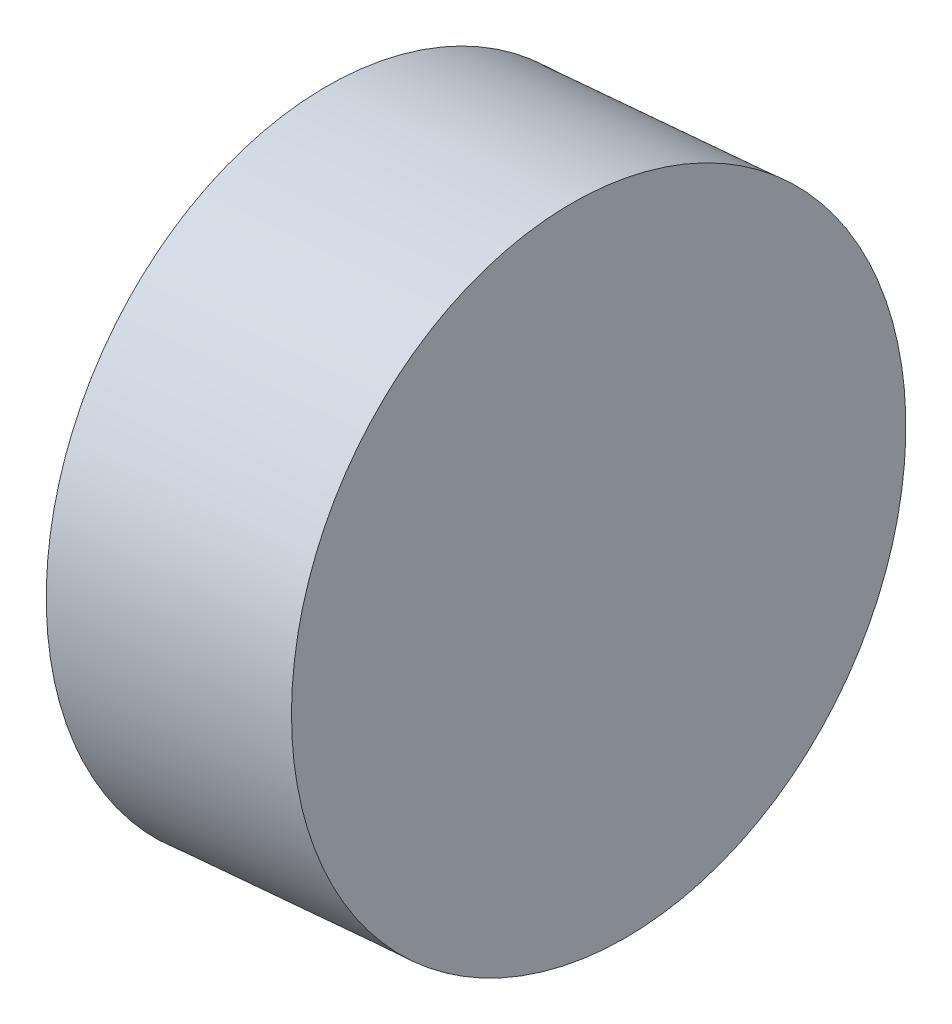
ISO-10303-21;
HEADER;
FILE_DESCRIPTION(('STEP AP214'),'2;1');
FILE_NAME('part.step','',(''),(''),'','','');
FILE_SCHEMA(('AUTOMOTIVE_DESIGN { 1 0 10303 214 1 1 1 1 }'));
ENDSEC;
DATA;
#1=APPLICATION_CONTEXT('core data for automotive mechanical design processes');
#2=APPLICATION_PROTOCOL_DEFINITION('international standard','automotive_design',2000,#1);
#3=PRODUCT_CONTEXT('',#1,'mechanical');
#4=PRODUCT('Part','Part','',(#3));
#5=PRODUCT_RELATED_PRODUCT_CATEGORY('part','',(#4));
#6=PRODUCT_DEFINITION_FORMATION('','',#4);
#7=PRODUCT_DEFINITION_CONTEXT('part definition',#1,'design');
#8=PRODUCT_DEFINITION('design','',#6,#7);
#9=PRODUCT_DEFINITION_SHAPE('','',#8);
#10=(LENGTH_UNIT() NAMED_UNIT(*) SI_UNIT(.MILLI.,.METRE.));
#11=(NAMED_UNIT(*) PLANE_ANGLE_UNIT() SI_UNIT($,.RADIAN.));
#12=(NAMED_UNIT(*) SI_UNIT($,.STERADIAN.) SOLID_ANGLE_UNIT());
#13=UNCERTAINTY_MEASURE_WITH_UNIT(LENGTH_MEASURE(1.E-05),#10,'distance_accuracy_value','');
#14=(GEOMETRIC_REPRESENTATION_CONTEXT(3) GLOBAL_UNCERTAINTY_ASSIGNED_CONTEXT((#13)) GLOBAL_UNIT_ASSIGNED_CONTEXT((#10,
#11,#12)) REPRESENTATION_CONTEXT('',''));
#15=CARTESIAN_POINT('',(0.,0.,0.));
#16=DIRECTION('',(0.,0.,1.));
#17=DIRECTION('',(1.,0.,0.));
#18=AXIS2_PLACEMENT_3D('',#15,#16,#17);
#19=CARTESIAN_POINT('',(-159.89779010804,1253.96431950315,1213.81116618222));
#20=CARTESIAN_POINT('',(-159.89779010804,1253.96431950315,1214.43169015902));
#21=CARTESIAN_POINT('',(-159.908443377123,1254.08608692596,1215.67273811262));
#22=CARTESIAN_POINT('',(-159.95576898926,1254.62702114795,1217.46277087773));
#23=CARTESIAN_POINT('',(-160.032621613177,1255.50545065893,1219.11247452223));
#24=CARTESIAN_POINT('',(-160.136047845636,1256.68761790542,1220.55845186023));
#25=CARTESIAN_POINT('',(-160.262073074526,1258.12809286309,1221.74513479354));
#26=CARTESIAN_POINT('',(-160.405854220976,1259.77151888717,1222.62691976255));
#27=CARTESIAN_POINT('',(-160.561865856161,1261.55474003717,1223.16992026539));
#28=CARTESIAN_POINT('',(-160.724112540434,1263.40922812436,1223.35326909726));
#29=CARTESIAN_POINT('',(-160.886359224707,1265.26371621155,1223.16992026539));
#30=CARTESIAN_POINT('',(-161.042370859892,1267.04693736156,1222.62691976255));
#31=CARTESIAN_POINT('',(-161.186152006342,1268.69036338563,1221.74513479354));
#32=CARTESIAN_POINT('',(-161.312177235232,1270.13083834331,1220.55845186023));
#33=CARTESIAN_POINT('',(-161.415603467691,1271.31300558979,1219.11247452223));
#34=CARTESIAN_POINT('',(-161.492456091608,1272.19143510077,1217.46277087773));
#35=CARTESIAN_POINT('',(-161.539781703746,1272.73236932276,1215.67273811262));
#36=CARTESIAN_POINT('',(-161.55576160737,1272.91502045698,1213.81116618222));
#37=CARTESIAN_POINT('',(-161.539781703746,1272.73236932276,1211.94959425181));
#38=CARTESIAN_POINT('',(-161.492456091608,1272.19143510077,1210.1595614867));
#39=CARTESIAN_POINT('',(-161.415603467691,1271.31300558979,1208.50985784221));
#40=CARTESIAN_POINT('',(-161.312177235232,1270.13083834331,1207.06388050421));
#41=CARTESIAN_POINT('',(-161.186152006342,1268.69036338563,1205.87719757089));
#42=CARTESIAN_POINT('',(-161.042370859892,1267.04693736156,1204.99541260189));
#43=CARTESIAN_POINT('',(-160.886359224707,1265.26371621155,1204.45241209904));
#44=CARTESIAN_POINT('',(-160.724112540434,1263.40922812436,1204.26906326717));
#45=CARTESIAN_POINT('',(-160.561865856161,1261.55474003717,1204.45241209904));
#46=CARTESIAN_POINT('',(-160.405854220976,1259.77151888717,1204.99541260189));
#47=CARTESIAN_POINT('',(-160.262073074526,1258.12809286309,1205.87719757089));
#48=CARTESIAN_POINT('',(-160.136047845636,1256.68761790542,1207.06388050421));
#49=CARTESIAN_POINT('',(-160.032621613177,1255.50545065893,1208.50985784221));
#50=CARTESIAN_POINT('',(-159.95576898926,1254.62702114795,1210.15956148671));
#51=CARTESIAN_POINT('',(-159.908443377122,1254.08608692596,1211.94959425181));
#52=CARTESIAN_POINT('',(-159.89779010804,1253.96431950315,1213.19064220541));
#53=CARTESIAN_POINT('',(-159.89779010804,1253.96431950315,1213.81116618222));
#54=B_SPLINE_CURVE_WITH_KNOTS('',3,(#19,#20,#21,#22,#23,#24,#25,#26,#27,#28,#29,#30,#31,#32,#33,
#34,#35,#36,#37,#38,#39,#40,#41,#42,#43,#44,#45,#46,#47,#48,#49,#50,#51,#52,#53),.UNSPECIFIED.,
.T.,.F.,(4,1,1,1,1,1,1,1,1,1,1,1,1,1,1,1,1,1,1,1,1,1,1,1,1,1,1,1,1,1,1,1,4),(0.,
0.0312499999999989,0.0625000000000002,0.0937500000000017,0.125,0.15625,0.1875,0.21875,0.25,
0.28125,0.3125,0.34375,0.375,0.406249999999998,0.4375,0.468750000000001,0.5,0.531249999999999,
0.5625,0.593750000000002,0.625,0.65625,0.6875,0.71875,0.75,0.78125,0.8125,0.84375,0.875,
0.906249999999998,0.9375,0.968750000000001,1.),.UNSPECIFIED.);
#55=DIRECTION('',(-0.996194698091745,-0.0871557427476584,0.));
#56=VECTOR('',#55,1.);
#57=SURFACE_OF_LINEAR_EXTRUSION('',#54,#56);
#58=CARTESIAN_POINT('',(-159.89779010804,1253.96431950315,1213.81116618222));
#59=CARTESIAN_POINT('',(-159.89779010804,1253.96431950315,1214.43169015902));
#60=CARTESIAN_POINT('',(-159.908443377123,1254.08608692596,1215.67273811262));
#61=CARTESIAN_POINT('',(-159.95576898926,1254.62702114795,1217.46277087773));
#62=CARTESIAN_POINT('',(-160.032621613177,1255.50545065893,1219.11247452223));
#63=CARTESIAN_POINT('',(-160.136047845636,1256.68761790542,1220.55845186023));
#64=CARTESIAN_POINT('',(-160.262073074526,1258.12809286309,1221.74513479354));
#65=CARTESIAN_POINT('',(-160.405854220976,1259.77151888717,1222.62691976255));
#66=CARTESIAN_POINT('',(-160.561865856161,1261.55474003717,1223.16992026539));
#67=CARTESIAN_POINT('',(-160.724112540434,1263.40922812436,1223.35326909726));
#68=CARTESIAN_POINT('',(-160.886359224707,1265.26371621155,1223.16992026539));
#69=CARTESIAN_POINT('',(-161.042370859892,1267.04693736156,1222.62691976255));
#70=CARTESIAN_POINT('',(-161.186152006342,1268.69036338563,1221.74513479354));
#71=CARTESIAN_POINT('',(-161.312177235232,1270.13083834331,1220.55845186023));
#72=CARTESIAN_POINT('',(-161.415603467691,1271.31300558979,1219.11247452223));
#73=CARTESIAN_POINT('',(-161.492456091608,1272.19143510077,1217.46277087773));
#74=CARTESIAN_POINT('',(-161.539781703746,1272.73236932276,1215.67273811262));
#75=CARTESIAN_POINT('',(-161.55576160737,1272.91502045698,1213.81116618222));
#76=CARTESIAN_POINT('',(-161.539781703746,1272.73236932276,1211.94959425181));
#77=CARTESIAN_POINT('',(-161.492456091608,1272.19143510077,1210.1595614867));
#78=CARTESIAN_POINT('',(-161.415603467691,1271.31300558979,1208.50985784221));
#79=CARTESIAN_POINT('',(-161.312177235232,1270.13083834331,1207.06388050421));
#80=CARTESIAN_POINT('',(-161.186152006342,1268.69036338563,1205.87719757089));
#81=CARTESIAN_POINT('',(-161.042370859892,1267.04693736156,1204.99541260189));
#82=CARTESIAN_POINT('',(-160.886359224707,1265.26371621155,1204.45241209904));
#83=CARTESIAN_POINT('',(-160.724112540434,1263.40922812436,1204.26906326717));
#84=CARTESIAN_POINT('',(-160.561865856161,1261.55474003717,1204.45241209904));
#85=CARTESIAN_POINT('',(-160.405854220976,1259.77151888717,1204.99541260189));
#86=CARTESIAN_POINT('',(-160.262073074526,1258.12809286309,1205.87719757089));
#87=CARTESIAN_POINT('',(-160.136047845636,1256.68761790542,1207.06388050421));
#88=CARTESIAN_POINT('',(-160.032621613177,1255.50545065893,1208.50985784221));
#89=CARTESIAN_POINT('',(-159.95576898926,1254.62702114795,1210.15956148671));
#90=CARTESIAN_POINT('',(-159.908443377122,1254.08608692596,1211.94959425181));
#91=CARTESIAN_POINT('',(-159.89779010804,1253.96431950315,1213.19064220541));
#92=CARTESIAN_POINT('',(-159.89779010804,1253.96431950315,1213.81116618222));
#93=B_SPLINE_CURVE_WITH_KNOTS('',3,(#58,#59,#60,#61,#62,#63,#64,#65,#66,#67,#68,#69,#70,#71,#72,
#73,#74,#75,#76,#77,#78,#79,#80,#81,#82,#83,#84,#85,#86,#87,#88,#89,#90,#91,#92),.UNSPECIFIED.,
.T.,.F.,(4,1,1,1,1,1,1,1,1,1,1,1,1,1,1,1,1,1,1,1,1,1,1,1,1,1,1,1,1,1,1,1,4),(0.,
0.0312499999999989,0.0625000000000002,0.0937500000000017,0.125,0.15625,0.1875,0.21875,0.25,
0.28125,0.3125,0.34375,0.375,0.406249999999998,0.4375,0.468750000000001,0.5,0.531249999999999,
0.5625,0.593750000000002,0.625,0.65625,0.6875,0.71875,0.75,0.78125,0.8125,0.84375,0.875,
0.906249999999998,0.9375,0.968750000000001,1.),.UNSPECIFIED.);
#94=CARTESIAN_POINT('',(-159.89779010804,1253.96431950315,1213.81116618222));
#95=VERTEX_POINT('',#94);
#96=EDGE_CURVE('E9',#95,#95,#93,.T.);
#97=ORIENTED_EDGE('',*,*,#96,.T.);
#98=EDGE_LOOP('',(#97));
#99=FACE_BOUND('',#98,.T.);
#100=CARTESIAN_POINT('',(-167.495774466541,1253.29958200614,1213.81116618222));
#101=CARTESIAN_POINT('',(-167.495774469345,1253.29958203819,1213.65603423546));
#102=CARTESIAN_POINT('',(-167.496107385176,1253.30338728354,1213.50090341773));
#103=CARTESIAN_POINT('',(-167.497435842588,1253.31857162125,1213.19101437774));
#104=CARTESIAN_POINT('',(-167.498431389317,1253.32995077243,1213.03625615838));
#105=CARTESIAN_POINT('',(-167.501081908129,1253.36024634108,1212.7274850742));
#106=CARTESIAN_POINT('',(-167.502736880212,1253.37916275854,1212.57347220937));
#107=CARTESIAN_POINT('',(-167.506703071408,1253.42449653137,1212.26656364659));
#108=CARTESIAN_POINT('',(-167.509014285425,1253.45091382846,1212.11366793997));
#109=CARTESIAN_POINT('',(-167.514289755327,1253.51121272536,1211.80936695208));
#110=CARTESIAN_POINT('',(-167.517254011212,1253.54509432517,1211.65796167082));
#111=CARTESIAN_POINT('',(-167.523826068409,1253.62021328266,1211.35700035729));
#112=CARTESIAN_POINT('',(-167.527433874718,1253.66145069748,1211.20744433941));
#113=CARTESIAN_POINT('',(-167.535283572012,1253.7511731481,1210.91053924435));
#114=CARTESIAN_POINT('',(-167.539525462995,1253.79965818391,1210.76319016718));
#115=CARTESIAN_POINT('',(-167.548633886012,1253.90376793538,1210.47105670582));
#116=CARTESIAN_POINT('',(-167.553500413192,1253.95939259559,1210.32627230171));
#117=CARTESIAN_POINT('',(-167.56384861959,1254.07767313595,1210.03962704523));
#118=CARTESIAN_POINT('',(-167.569330298807,1254.14032901611,1209.89776619285));
#119=CARTESIAN_POINT('',(-167.580893393827,1254.27249579697,1209.61729872609));
#120=CARTESIAN_POINT('',(-167.586974814289,1254.34200675092,1209.478692137));
#121=CARTESIAN_POINT('',(-167.599722030998,1254.48770810462,1209.20506283471));
#122=CARTESIAN_POINT('',(-167.606387827245,1254.56389850436,1209.07004012151));
#123=CARTESIAN_POINT('',(-167.620288450385,1254.7227833539,1208.80390831148));
#124=CARTESIAN_POINT('',(-167.627523272859,1254.80547775318,1208.67279918426));
#125=CARTESIAN_POINT('',(-167.642546540012,1254.97719448249,1208.41482526898));
#126=CARTESIAN_POINT('',(-167.650334984692,1255.06621681254,1208.28796048093));
#127=CARTESIAN_POINT('',(-167.666444754271,1255.25035232142,1208.03876507017));
#128=CARTESIAN_POINT('',(-167.67476608331,1255.34546554756,1207.91643448271));
#129=CARTESIAN_POINT('',(-167.691920951047,1255.54154658304,1207.67659639334));
#130=CARTESIAN_POINT('',(-167.700754489745,1255.64251439238,1207.55908889143));
#131=CARTESIAN_POINT('',(-167.718913119858,1255.85006848432,1207.32918602908));
#132=CARTESIAN_POINT('',(-167.728238207454,1255.95665472327,1207.21679062893));
#133=CARTESIAN_POINT('',(-167.747359199631,1256.17520866394,1206.99740184771));
#134=CARTESIAN_POINT('',(-167.757155104213,1256.28717636565,1206.89040846665));
#135=CARTESIAN_POINT('',(-167.777192458941,1256.51620437821,1206.68206155179));
#136=CARTESIAN_POINT('',(-167.787433912548,1256.63326472859,1206.58070806183));
#137=CARTESIAN_POINT('',(-167.808337179366,1256.87219016162,1206.38387802865));
#138=CARTESIAN_POINT('',(-167.818998992577,1256.99405524427,1206.28840148544));
#139=CARTESIAN_POINT('',(-167.840717803691,1257.24230239125,1206.10356260883));
#140=CARTESIAN_POINT('',(-167.851774798523,1257.36868442049,1206.01420022794));
#141=CARTESIAN_POINT('',(-167.874258706718,1257.62567666713,1205.84182756861));
#142=CARTESIAN_POINT('',(-167.885685620082,1257.75628688454,1205.75881729017));
#143=CARTESIAN_POINT('',(-167.908880535654,1258.02140598268,1205.59932552632));
#144=CARTESIAN_POINT('',(-167.920648540511,1258.1559148937,1205.52284409162));
#145=CARTESIAN_POINT('',(-167.944496905589,1258.42850295388,1205.37658618243));
#146=CARTESIAN_POINT('',(-167.956577265811,1258.56658210305,1205.30680970792));
#147=CARTESIAN_POINT('',(-167.981021616194,1258.84598230643,1205.17413807143));
#148=CARTESIAN_POINT('',(-167.993385604151,1258.98730333545,1205.11124285599));
#149=CARTESIAN_POINT('',(-168.018368384382,1259.27285782016,1204.99251050318));
#150=CARTESIAN_POINT('',(-168.030987176655,1259.41709127584,1204.93667336581));
#151=CARTESIAN_POINT('',(-168.056448285473,1259.70811308132,1204.83216593199));
#152=CARTESIAN_POINT('',(-168.069290603753,1259.85490145094,1204.78349569122));
#153=CARTESIAN_POINT('',(-168.095167587796,1260.150676732,1204.69343051543));
#154=CARTESIAN_POINT('',(-168.108202253559,1260.29966364342,1204.65203558042));
#155=CARTESIAN_POINT('',(-168.134432760535,1260.59947971008,1204.57662968062));
#156=CARTESIAN_POINT('',(-168.147628600494,1260.75030885099,1204.54261865849));
#157=CARTESIAN_POINT('',(-168.174150178526,1261.05345187505,1204.48208942993));
#158=CARTESIAN_POINT('',(-168.187475916599,1261.2057657582,1204.4555712235));
#159=CARTESIAN_POINT('',(-168.21422476253,1261.51150646623,1204.4100642818));
#160=CARTESIAN_POINT('',(-168.227647871143,1261.66493329974,1204.391075605));
#161=CARTESIAN_POINT('',(-168.254559036166,1261.97252932348,1204.36066431682));
#162=CARTESIAN_POINT('',(-168.268047092576,1262.12669851371,1204.34924170544));
#163=CARTESIAN_POINT('',(-168.295055732472,1262.43540868034,1204.33399934879));
#164=CARTESIAN_POINT('',(-168.308576315703,1262.58994965384,1204.33017954446));
#165=CARTESIAN_POINT('',(-168.335617482167,1262.89903160085,1204.33017954446));
#166=CARTESIAN_POINT('',(-168.349138065398,1263.05357257435,1204.33399934879));
#167=CARTESIAN_POINT('',(-168.376146705294,1263.36228274098,1204.34924170544));
#168=CARTESIAN_POINT('',(-168.389634761704,1263.51645193121,1204.36066431682));
#169=CARTESIAN_POINT('',(-168.416545926727,1263.82404795495,1204.391075605));
#170=CARTESIAN_POINT('',(-168.42996903534,1263.97747478847,1204.4100642818));
#171=CARTESIAN_POINT('',(-168.456717881271,1264.28321549649,1204.4555712235));
#172=CARTESIAN_POINT('',(-168.470043619344,1264.43552937964,1204.48208942993));
#173=CARTESIAN_POINT('',(-168.496565197376,1264.7386724037,1204.54261865849));
#174=CARTESIAN_POINT('',(-168.509761037335,1264.88950154461,1204.57662968062));
#175=CARTESIAN_POINT('',(-168.535991544311,1265.18931761127,1204.65203558042));
#176=CARTESIAN_POINT('',(-168.549026210074,1265.3383045227,1204.69343051543));
#177=CARTESIAN_POINT('',(-168.574903194118,1265.63407980375,1204.78349569122));
#178=CARTESIAN_POINT('',(-168.587745512397,1265.78086817337,1204.83216593199));
#179=CARTESIAN_POINT('',(-168.613206621215,1266.07188997885,1204.93667336581));
#180=CARTESIAN_POINT('',(-168.625825413489,1266.21612343453,1204.99251050318));
#181=CARTESIAN_POINT('',(-168.650808193719,1266.50167791924,1205.11124285599));
#182=CARTESIAN_POINT('',(-168.663172181676,1266.64299894826,1205.17413807143));
#183=CARTESIAN_POINT('',(-168.687616532059,1266.92239915164,1205.30680970792));
#184=CARTESIAN_POINT('',(-168.699696892281,1267.06047830081,1205.37658618243));
#185=CARTESIAN_POINT('',(-168.72354525736,1267.333066361,1205.52284409162));
#186=CARTESIAN_POINT('',(-168.735313262216,1267.46757527201,1205.59932552631));
#187=CARTESIAN_POINT('',(-168.758508177788,1267.73269437015,1205.75881729017));
#188=CARTESIAN_POINT('',(-168.769935091152,1267.86330458756,1205.84182756861));
#189=CARTESIAN_POINT('',(-168.792418999347,1268.1202968342,1206.01420022794));
#190=CARTESIAN_POINT('',(-168.803475994179,1268.24667886344,1206.10356260883));
#191=CARTESIAN_POINT('',(-168.825194805293,1268.49492601042,1206.28840148544));
#192=CARTESIAN_POINT('',(-168.835856618504,1268.61679109307,1206.38387802865));
#193=CARTESIAN_POINT('',(-168.856759885322,1268.8557165261,1206.58070806183));
#194=CARTESIAN_POINT('',(-168.867001338929,1268.97277687649,1206.68206155179));
#195=CARTESIAN_POINT('',(-168.887038693657,1269.20180488904,1206.89040846665));
#196=CARTESIAN_POINT('',(-168.896834598239,1269.31377259076,1206.99740184771));
#197=CARTESIAN_POINT('',(-168.915955590416,1269.53232653143,1207.21679062893));
#198=CARTESIAN_POINT('',(-168.925280678012,1269.63891277038,1207.32918602908));
#199=CARTESIAN_POINT('',(-168.943439308125,1269.84646686231,1207.55908889143));
#200=CARTESIAN_POINT('',(-168.952272846824,1269.94743467165,1207.67659639334));
#201=CARTESIAN_POINT('',(-168.96942771456,1270.14351570713,1207.91643448271));
#202=CARTESIAN_POINT('',(-168.977749043599,1270.23862893327,1208.03876507017));
#203=CARTESIAN_POINT('',(-168.993858813178,1270.42276444215,1208.28796048093));
#204=CARTESIAN_POINT('',(-169.001647257858,1270.5117867722,1208.41482526898));
#205=CARTESIAN_POINT('',(-169.016670525011,1270.68350350152,1208.67279918426));
#206=CARTESIAN_POINT('',(-169.023905347485,1270.76619790079,1208.80390831148));
#207=CARTESIAN_POINT('',(-169.037805970626,1270.92508275033,1209.07004012151));
#208=CARTESIAN_POINT('',(-169.044471766873,1271.00127315007,1209.20506283471));
#209=CARTESIAN_POINT('',(-169.057218983581,1271.14697450377,1209.478692137));
#210=CARTESIAN_POINT('',(-169.063300404043,1271.21648545772,1209.61729872609));
#211=CARTESIAN_POINT('',(-169.074863499063,1271.34865223858,1209.89776619286));
#212=CARTESIAN_POINT('',(-169.08034517828,1271.41130811874,1210.03962704525));
#213=CARTESIAN_POINT('',(-169.090693384678,1271.5295886591,1210.3262723017));
#214=CARTESIAN_POINT('',(-169.095559911858,1271.58521331931,1210.47105670575));
#215=CARTESIAN_POINT('',(-169.104668334875,1271.68932307079,1210.76319016724));
#216=CARTESIAN_POINT('',(-169.108910225859,1271.7378081066,1210.91053924459));
#217=CARTESIAN_POINT('',(-169.116759923151,1271.8275305572,1211.20744433917));
#218=CARTESIAN_POINT('',(-169.120367729458,1271.86876797199,1211.35700035639));
#219=CARTESIAN_POINT('',(-169.126939786662,1271.94388692957,1211.65796167172));
#220=CARTESIAN_POINT('',(-169.129904042558,1271.9777685295,1211.80936695544));
#221=CARTESIAN_POINT('',(-169.135179512431,1272.03806742607,1212.11366793661));
#222=CARTESIAN_POINT('',(-169.137490726408,1272.06448472271,1212.26656363405));
#223=CARTESIAN_POINT('',(-169.141456917713,1272.10981849676,1212.57347222191));
#224=CARTESIAN_POINT('',(-169.143111889942,1272.12873491591,1212.727485121));
#225=CARTESIAN_POINT('',(-169.145762408351,1272.15903047996,1213.03625611158));
#226=CARTESIAN_POINT('',(-169.146757954531,1272.17040962486,1213.19101420307));
#227=CARTESIAN_POINT('',(-169.148086413446,1272.18559397974,1213.50090359239));
#228=CARTESIAN_POINT('',(-169.148419331329,1272.18939924856,1213.6560348873));
#229=CARTESIAN_POINT('',(-169.148419331329,1272.18939924856,1213.96629747713));
#230=CARTESIAN_POINT('',(-169.148086413446,1272.18559397974,1214.12142877205));
#231=CARTESIAN_POINT('',(-169.146757954531,1272.17040962486,1214.43131816136));
#232=CARTESIAN_POINT('',(-169.145762408351,1272.15903047996,1214.58607625285));
#233=CARTESIAN_POINT('',(-169.143111889942,1272.12873491591,1214.89484724343));
#234=CARTESIAN_POINT('',(-169.141456917713,1272.10981849676,1215.04886014253));
#235=CARTESIAN_POINT('',(-169.137490726408,1272.06448472271,1215.35576873039));
#236=CARTESIAN_POINT('',(-169.135179512431,1272.03806742607,1215.50866442783));
#237=CARTESIAN_POINT('',(-169.129904042558,1271.9777685295,1215.81296540899));
#238=CARTESIAN_POINT('',(-169.126939786662,1271.94388692957,1215.96437069272));
#239=CARTESIAN_POINT('',(-169.120367729458,1271.86876797199,1216.26533200804));
#240=CARTESIAN_POINT('',(-169.116759923151,1271.8275305572,1216.41488802527));
#241=CARTESIAN_POINT('',(-169.108910225859,1271.7378081066,1216.71179311984));
#242=CARTESIAN_POINT('',(-169.104668334875,1271.68932307079,1216.85914219719));
#243=CARTESIAN_POINT('',(-169.095559911858,1271.58521331931,1217.15127565868));
#244=CARTESIAN_POINT('',(-169.090693384678,1271.5295886591,1217.29606006274));
#245=CARTESIAN_POINT('',(-169.08034517828,1271.41130811874,1217.58270531918));
#246=CARTESIAN_POINT('',(-169.074863499063,1271.34865223859,1217.72456617158));
#247=CARTESIAN_POINT('',(-169.063300404043,1271.21648545772,1218.00503363835));
#248=CARTESIAN_POINT('',(-169.057218983581,1271.14697450377,1218.14364022743));
#249=CARTESIAN_POINT('',(-169.044471766873,1271.00127315007,1218.41726952972));
#250=CARTESIAN_POINT('',(-169.037805970626,1270.92508275033,1218.55229224293));
#251=CARTESIAN_POINT('',(-169.023905347485,1270.76619790079,1218.81842405295));
#252=CARTESIAN_POINT('',(-169.016670525011,1270.68350350152,1218.94953318017));
#253=CARTESIAN_POINT('',(-169.001647257858,1270.5117867722,1219.20750709545));
#254=CARTESIAN_POINT('',(-168.993858813178,1270.42276444215,1219.33437188351));
#255=CARTESIAN_POINT('',(-168.977749043599,1270.23862893327,1219.58356729426));
#256=CARTESIAN_POINT('',(-168.96942771456,1270.14351570713,1219.70589788172));
#257=CARTESIAN_POINT('',(-168.952272846824,1269.94743467165,1219.9457359711));
#258=CARTESIAN_POINT('',(-168.943439308125,1269.84646686231,1220.063243473));
#259=CARTESIAN_POINT('',(-168.925280678012,1269.63891277038,1220.29314633535));
#260=CARTESIAN_POINT('',(-168.915955590416,1269.53232653143,1220.4055417355));
#261=CARTESIAN_POINT('',(-168.896834598239,1269.31377259076,1220.62493051672));
#262=CARTESIAN_POINT('',(-168.887038693657,1269.20180488904,1220.73192389779));
#263=CARTESIAN_POINT('',(-168.867001338929,1268.97277687649,1220.94027081264));
#264=CARTESIAN_POINT('',(-168.856759885322,1268.8557165261,1221.04162430261));
#265=CARTESIAN_POINT('',(-168.835856618504,1268.61679109307,1221.23845433579));
#266=CARTESIAN_POINT('',(-168.825194805293,1268.49492601042,1221.333930879));
#267=CARTESIAN_POINT('',(-168.803475994179,1268.24667886344,1221.51876975561));
#268=CARTESIAN_POINT('',(-168.792418999347,1268.1202968342,1221.60813213649));
#269=CARTESIAN_POINT('',(-168.769935091152,1267.86330458756,1221.78050479582));
#270=CARTESIAN_POINT('',(-168.758508177788,1267.73269437015,1221.86351507426));
#271=CARTESIAN_POINT('',(-168.735313262216,1267.46757527201,1222.02300683812));
#272=CARTESIAN_POINT('',(-168.72354525736,1267.333066361,1222.09948827281));
#273=CARTESIAN_POINT('',(-168.699696892281,1267.06047830081,1222.24574618201));
#274=CARTESIAN_POINT('',(-168.687616532059,1266.92239915164,1222.31552265651));
#275=CARTESIAN_POINT('',(-168.663172181676,1266.64299894826,1222.44819429301));
#276=CARTESIAN_POINT('',(-168.650808193719,1266.50167791924,1222.51108950845));
#277=CARTESIAN_POINT('',(-168.625825413489,1266.21612343453,1222.62982186126));
#278=CARTESIAN_POINT('',(-168.613206621215,1266.07188997885,1222.68565899863));
#279=CARTESIAN_POINT('',(-168.587745512397,1265.78086817337,1222.79016643244));
#280=CARTESIAN_POINT('',(-168.574903194118,1265.63407980375,1222.83883667322));
#281=CARTESIAN_POINT('',(-168.549026210074,1265.3383045227,1222.928901849));
#282=CARTESIAN_POINT('',(-168.535991544311,1265.18931761127,1222.97029678402));
#283=CARTESIAN_POINT('',(-168.509761037335,1264.88950154461,1223.04570268381));
#284=CARTESIAN_POINT('',(-168.496565197376,1264.7386724037,1223.07971370595));
#285=CARTESIAN_POINT('',(-168.470043619344,1264.43552937964,1223.14024293451));
#286=CARTESIAN_POINT('',(-168.456717881271,1264.28321549649,1223.16676114093));
#287=CARTESIAN_POINT('',(-168.42996903534,1263.97747478847,1223.21226808264));
#288=CARTESIAN_POINT('',(-168.416545926727,1263.82404795495,1223.23125675943));
#289=CARTESIAN_POINT('',(-168.389634761704,1263.51645193121,1223.26166804761));
#290=CARTESIAN_POINT('',(-168.376146705294,1263.36228274098,1223.27309065899));
#291=CARTESIAN_POINT('',(-168.349138065399,1263.05357257435,1223.28833301565));
#292=CARTESIAN_POINT('',(-168.335617482167,1262.89903160085,1223.29215281997));
#293=CARTESIAN_POINT('',(-168.308576315703,1262.58994965384,1223.29215281997));
#294=CARTESIAN_POINT('',(-168.295055732472,1262.43540868034,1223.28833301565));
#295=CARTESIAN_POINT('',(-168.268047092576,1262.12669851371,1223.27309065899));
#296=CARTESIAN_POINT('',(-168.254559036166,1261.97252932348,1223.26166804761));
#297=CARTESIAN_POINT('',(-168.227647871143,1261.66493329974,1223.23125675943));
#298=CARTESIAN_POINT('',(-168.21422476253,1261.51150646623,1223.21226808264));
#299=CARTESIAN_POINT('',(-168.187475916599,1261.2057657582,1223.16676114093));
#300=CARTESIAN_POINT('',(-168.174150178526,1261.05345187505,1223.14024293451));
#301=CARTESIAN_POINT('',(-168.147628600494,1260.75030885099,1223.07971370595));
#302=CARTESIAN_POINT('',(-168.134432760535,1260.59947971008,1223.04570268381));
#303=CARTESIAN_POINT('',(-168.108202253559,1260.29966364342,1222.97029678402));
#304=CARTESIAN_POINT('',(-168.095167587796,1260.150676732,1222.928901849));
#305=CARTESIAN_POINT('',(-168.069290603753,1259.85490145094,1222.83883667322));
#306=CARTESIAN_POINT('',(-168.056448285473,1259.70811308132,1222.79016643244));
#307=CARTESIAN_POINT('',(-168.030987176655,1259.41709127584,1222.68565899863));
#308=CARTESIAN_POINT('',(-168.018368384382,1259.27285782016,1222.62982186126));
#309=CARTESIAN_POINT('',(-167.993385604151,1258.98730333545,1222.51108950845));
#310=CARTESIAN_POINT('',(-167.981021616194,1258.84598230643,1222.44819429301));
#311=CARTESIAN_POINT('',(-167.956577265811,1258.56658210305,1222.31552265651));
#312=CARTESIAN_POINT('',(-167.944496905589,1258.42850295388,1222.24574618201));
#313=CARTESIAN_POINT('',(-167.920648540511,1258.1559148937,1222.09948827281));
#314=CARTESIAN_POINT('',(-167.908880535654,1258.02140598268,1222.02300683812));
#315=CARTESIAN_POINT('',(-167.885685620082,1257.75628688454,1221.86351507426));
#316=CARTESIAN_POINT('',(-167.874258706718,1257.62567666713,1221.78050479582));
#317=CARTESIAN_POINT('',(-167.851774798523,1257.36868442049,1221.60813213649));
#318=CARTESIAN_POINT('',(-167.840717803691,1257.24230239125,1221.51876975561));
#319=CARTESIAN_POINT('',(-167.818998992577,1256.99405524427,1221.333930879));
#320=CARTESIAN_POINT('',(-167.808337179366,1256.87219016162,1221.23845433579));
#321=CARTESIAN_POINT('',(-167.787433912548,1256.63326472859,1221.04162430261));
#322=CARTESIAN_POINT('',(-167.777192458941,1256.51620437821,1220.94027081264));
#323=CARTESIAN_POINT('',(-167.757155104213,1256.28717636565,1220.73192389779));
#324=CARTESIAN_POINT('',(-167.747359199631,1256.17520866393,1220.62493051672));
#325=CARTESIAN_POINT('',(-167.728238207454,1255.95665472327,1220.4055417355));
#326=CARTESIAN_POINT('',(-167.718913119858,1255.85006848432,1220.29314633535));
#327=CARTESIAN_POINT('',(-167.700754489745,1255.64251439238,1220.063243473));
#328=CARTESIAN_POINT('',(-167.691920951047,1255.54154658304,1219.9457359711));
#329=CARTESIAN_POINT('',(-167.67476608331,1255.34546554756,1219.70589788172));
#330=CARTESIAN_POINT('',(-167.666444754271,1255.25035232142,1219.58356729426));
#331=CARTESIAN_POINT('',(-167.650334984692,1255.06621681254,1219.33437188351));
#332=CARTESIAN_POINT('',(-167.642546540012,1254.97719448249,1219.20750709545));
#333=CARTESIAN_POINT('',(-167.627523272859,1254.80547775318,1218.94953318017));
#334=CARTESIAN_POINT('',(-167.620288450385,1254.7227833539,1218.81842405295));
#335=CARTESIAN_POINT('',(-167.606387827245,1254.56389850436,1218.55229224293));
#336=CARTESIAN_POINT('',(-167.599722030997,1254.48770810462,1218.41726952973));
#337=CARTESIAN_POINT('',(-167.586974814289,1254.34200675092,1218.14364022743));
#338=CARTESIAN_POINT('',(-167.580893393827,1254.27249579697,1218.00503363834));
#339=CARTESIAN_POINT('',(-167.569330298807,1254.14032901611,1217.72456617158));
#340=CARTESIAN_POINT('',(-167.56384861959,1254.07767313595,1217.5827053192));
#341=CARTESIAN_POINT('',(-167.553500413192,1253.95939259559,1217.29606006272));
#342=CARTESIAN_POINT('',(-167.548633886012,1253.90376793538,1217.15127565862));
#343=CARTESIAN_POINT('',(-167.539525462995,1253.79965818391,1216.85914219726));
#344=CARTESIAN_POINT('',(-167.535283572012,1253.7511731481,1216.71179312008));
#345=CARTESIAN_POINT('',(-167.527433874718,1253.66145069748,1216.41488802502));
#346=CARTESIAN_POINT('',(-167.523826068409,1253.62021328266,1216.26533200714));
#347=CARTESIAN_POINT('',(-167.517254011212,1253.54509432517,1215.96437069362));
#348=CARTESIAN_POINT('',(-167.514289755327,1253.51121272536,1215.81296541235));
#349=CARTESIAN_POINT('',(-167.509014285425,1253.45091382846,1215.50866442446));
#350=CARTESIAN_POINT('',(-167.506703071408,1253.42449653137,1215.35576871785));
#351=CARTESIAN_POINT('',(-167.502736880212,1253.37916275855,1215.04886015507));
#352=CARTESIAN_POINT('',(-167.501081908129,1253.36024634108,1214.89484729024));
#353=CARTESIAN_POINT('',(-167.498431389317,1253.32995077243,1214.58607620605));
#354=CARTESIAN_POINT('',(-167.497435842588,1253.31857162125,1214.4313179867));
#355=CARTESIAN_POINT('',(-167.496107385176,1253.30338728354,1214.12142894671));
#356=CARTESIAN_POINT('',(-167.495774469345,1253.29958203819,1213.96629812898));
#357=CARTESIAN_POINT('',(-167.495774466541,1253.29958200614,1213.81116618222));
#358=B_SPLINE_CURVE_WITH_KNOTS('',3,(#100,#101,#102,#103,#104,#105,#106,#107,#108,#109,#110,
#111,#112,#113,#114,#115,#116,#117,#118,#119,#120,#121,#122,#123,#124,#125,#126,#127,#128,#129,
#130,#131,#132,#133,#134,#135,#136,#137,#138,#139,#140,#141,#142,#143,#144,#145,#146,#147,#148,
#149,#150,#151,#152,#153,#154,#155,#156,#157,#158,#159,#160,#161,#162,#163,#164,#165,#166,#167,
#168,#169,#170,#171,#172,#173,#174,#175,#176,#177,#178,#179,#180,#181,#182,#183,#184,#185,#186,
#187,#188,#189,#190,#191,#192,#193,#194,#195,#196,#197,#198,#199,#200,#201,#202,#203,#204,#205,
#206,#207,#208,#209,#210,#211,#212,#213,#214,#215,#216,#217,#218,#219,#220,#221,#222,#223,#224,
#225,#226,#227,#228,#229,#230,#231,#232,#233,#234,#235,#236,#237,#238,#239,#240,#241,#242,#243,
#244,#245,#246,#247,#248,#249,#250,#251,#252,#253,#254,#255,#256,#257,#258,#259,#260,#261,#262,
#263,#264,#265,#266,#267,#268,#269,#270,#271,#272,#273,#274,#275,#276,#277,#278,#279,#280,#281,
#282,#283,#284,#285,#286,#287,#288,#289,#290,#291,#292,#293,#294,#295,#296,#297,#298,#299,#300,
#301,#302,#303,#304,#305,#306,#307,#308,#309,#310,#311,#312,#313,#314,#315,#316,#317,#318,#319,
#320,#321,#322,#323,#324,#325,#326,#327,#328,#329,#330,#331,#332,#333,#334,#335,#336,#337,#338,
#339,#340,#341,#342,#343,#344,#345,#346,#347,#348,#349,#350,#351,#352,#353,#354,#355,#356,#357),
.UNSPECIFIED.,.F.,.F.,(4,2,2,2,2,2,2,2,2,2,2,2,2,2,2,2,2,2,2,2,2,2,2,2,2,2,2,2,2,2,2,2,2,2,2,2,
2,2,2,2,2,2,2,2,2,2,2,2,2,2,2,2,2,2,2,2,2,2,2,2,2,2,2,2,2,2,2,2,2,2,2,2,2,2,2,2,2,2,2,2,2,2,2,2,
2,2,2,2,2,2,2,2,2,2,2,2,2,2,2,2,2,2,2,2,2,2,2,2,2,2,2,2,2,2,2,2,2,2,2,2,2,2,2,2,2,2,2,2,4),(0.,
0.465347346643626,0.930698308053265,1.39604926946289,1.8613966161065,2.32674396275056,
2.79209492415995,3.25744588556959,3.72279323221345,4.18814057885721,4.65349154026675,
5.11884250167667,5.58418984832017,6.04953719496406,6.51488815637395,6.9802391177836,
7.44558646442724,7.91093381107103,8.37628477248076,8.84163573389054,9.30698308053417,
9.77233042717769,10.2376813885873,10.703032349997,11.1683796966408,11.6337270432841,
12.0990780046941,12.5644289661041,13.0297763127479,13.4951236593912,13.9604746208013,
14.4258255822108,14.8911729288545,15.356520275498,15.8218712369077,16.2872221983175,
16.7525695449613,17.2179168916046,17.6832678530144,18.1486188144241,18.6139661610679,
19.0793135077115,19.5446644691214,20.0100154305312,20.475362777175,20.9407101238187,
21.4060610852282,21.8714120466382,22.3367593932818,22.8021067399255,23.2674577013356,
23.7328086627453,24.1981560093888,24.6635033560325,25.1288543174422,25.5942052788519,
26.0595526254953,26.5248999721386,26.9902509335485,27.4556018949581,27.9209492416019,
28.3862965882457,28.8516475496554,29.316998511065,29.7823458577089,30.2476932043525,
30.7130441657624,31.1783951271718,31.6437424738158,32.1090898204592,32.574440781869,
33.0397917432789,33.5051390899224,33.9704864365661,34.435837397976,34.9011883593857,
35.366535706029,35.8318830526729,36.2972340140826,36.7625849754926,37.2279323221361,
37.6932796687797,38.1586306301894,38.6239815915988,39.0893289382427,39.5546762848865,
40.0200272462963,40.485378207706,40.9507255543495,41.4160729009933,41.8814238624029,
42.3467748238127,42.8121221704564,43.2774695171002,43.7428204785096,44.2081714399196,
44.6735187865633,45.138866133207,45.6042170946169,46.0695680560268,46.5349154026703,
47.0002627493139,47.4656137107237,47.9309646721331,48.3963120187767,48.8616593654203,
49.3270103268302,49.7923612882399,50.2577086348835,50.7230559815274,51.1884069429373,
51.653757904347,52.1191052509908,52.5844525976341,53.0498035590443,53.5151545204541,
53.9805018670974,54.4458492137414,54.911200175151,55.3765511365607,55.8418984832043,
56.3072458298478,56.7725967912575,57.2379477526673,57.7032950993111,58.1686424459545,
58.6339934073644,59.0993443687738,59.5646917154176),.UNSPECIFIED.);
#359=CARTESIAN_POINT('',(-167.495774466541,1253.29958200614,1213.81116618222));
#360=VERTEX_POINT('',#359);
#361=EDGE_CURVE('E24',#360,#360,#358,.F.);
#362=ORIENTED_EDGE('',*,*,#361,.F.);
#363=EDGE_LOOP('',(#362));
#364=FACE_BOUND('',#363,.T.);
#365=ADVANCED_FACE('F14',(#99,#364),#57,.T.);
#366=CARTESIAN_POINT('',(-160.095187281237,1256.22057951721,1219.55049299476));
#367=DIRECTION('',(-0.996194698091746,-0.0871557427476584,0.));
#368=DIRECTION('',(0.0871557427476584,-0.996194698091746,0.));
#369=AXIS2_PLACEMENT_3D('',#366,#367,#368);
#370=PLANE('',#369);
#371=ORIENTED_EDGE('',*,*,#96,.F.);
#372=EDGE_LOOP('',(#371));
#373=FACE_BOUND('',#372,.T.);
#374=ADVANCED_FACE('F62',(#373),#370,.F.);
#375=CARTESIAN_POINT('',(-167.693171639738,1255.55584202019,1219.55049299476));
#376=DIRECTION('',(-0.996194698091746,-0.0871557427476584,0.));
#377=DIRECTION('',(0.0871557427476584,-0.996194698091746,0.));
#378=AXIS2_PLACEMENT_3D('',#375,#376,#377);
#379=PLANE('',#378);
#380=ORIENTED_EDGE('',*,*,#361,.T.);
#381=EDGE_LOOP('',(#380));
#382=FACE_BOUND('',#381,.T.);
#383=ADVANCED_FACE('F31',(#382),#379,.T.);
#384=CLOSED_SHELL('',(#365,#374,#383));
#385=MANIFOLD_SOLID_BREP('B1',#384);
#386=ADVANCED_BREP_SHAPE_REPRESENTATION('',(#18,#385),#14);
#387=SHAPE_DEFINITION_REPRESENTATION(#9,#386);
ENDSEC;
END-ISO-10303-21;
